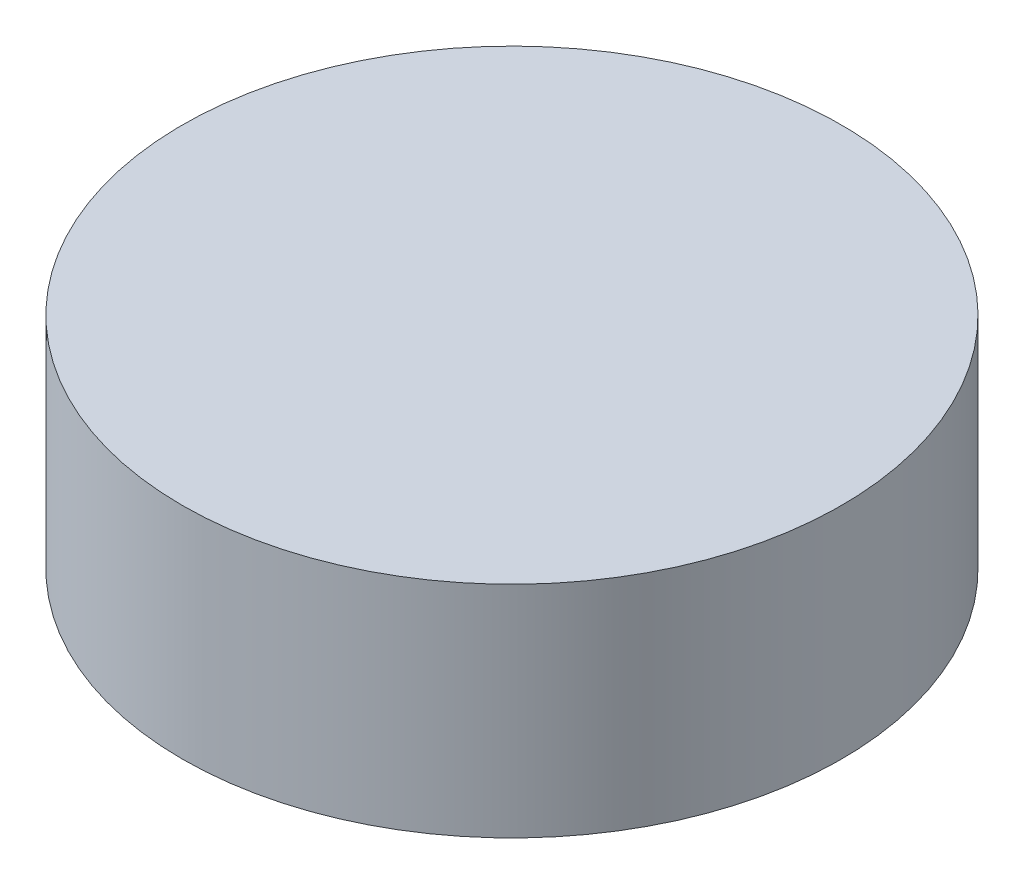
ISO-10303-21;
HEADER;
FILE_DESCRIPTION(('STEP AP214'),'2;1');
FILE_NAME('part.step','',(''),(''),'','','');
FILE_SCHEMA(('AUTOMOTIVE_DESIGN { 1 0 10303 214 1 1 1 1 }'));
ENDSEC;
DATA;
#1=APPLICATION_CONTEXT('core data for automotive mechanical design processes');
#2=APPLICATION_PROTOCOL_DEFINITION('international standard','automotive_design',2000,#1);
#3=PRODUCT_CONTEXT('',#1,'mechanical');
#4=PRODUCT('Part','Part','',(#3));
#5=PRODUCT_RELATED_PRODUCT_CATEGORY('part','',(#4));
#6=PRODUCT_DEFINITION_FORMATION('','',#4);
#7=PRODUCT_DEFINITION_CONTEXT('part definition',#1,'design');
#8=PRODUCT_DEFINITION('design','',#6,#7);
#9=PRODUCT_DEFINITION_SHAPE('','',#8);
#10=(LENGTH_UNIT() NAMED_UNIT(*) SI_UNIT(.MILLI.,.METRE.));
#11=(NAMED_UNIT(*) PLANE_ANGLE_UNIT() SI_UNIT($,.RADIAN.));
#12=(NAMED_UNIT(*) SI_UNIT($,.STERADIAN.) SOLID_ANGLE_UNIT());
#13=UNCERTAINTY_MEASURE_WITH_UNIT(LENGTH_MEASURE(1.E-05),#10,'distance_accuracy_value','');
#14=(GEOMETRIC_REPRESENTATION_CONTEXT(3) GLOBAL_UNCERTAINTY_ASSIGNED_CONTEXT((#13)) GLOBAL_UNIT_ASSIGNED_CONTEXT((#10,
#11,#12)) REPRESENTATION_CONTEXT('',''));
#15=CARTESIAN_POINT('',(0.,0.,0.));
#16=DIRECTION('',(0.,0.,1.));
#17=DIRECTION('',(1.,0.,0.));
#18=AXIS2_PLACEMENT_3D('',#15,#16,#17);
#19=CARTESIAN_POINT('',(0.,5.,0.));
#20=DIRECTION('',(0.,-1.,0.));
#21=DIRECTION('',(0.,0.,-1.));
#22=AXIS2_PLACEMENT_3D('',#19,#20,#21);
#23=CYLINDRICAL_SURFACE('',#22,7.5);
#24=CARTESIAN_POINT('',(0.,5.,0.));
#25=DIRECTION('',(0.,1.,0.));
#26=DIRECTION('',(0.,0.,1.));
#27=AXIS2_PLACEMENT_3D('',#24,#25,#26);
#28=CIRCLE('',#27,7.5);
#29=CARTESIAN_POINT('',(0.,5.,7.5));
#30=VERTEX_POINT('',#29);
#31=EDGE_CURVE('E12',#30,#30,#28,.T.);
#32=ORIENTED_EDGE('',*,*,#31,.F.);
#33=EDGE_LOOP('',(#32));
#34=FACE_BOUND('',#33,.T.);
#35=CARTESIAN_POINT('',(0.,0.,0.));
#36=DIRECTION('',(0.,1.,0.));
#37=DIRECTION('',(0.,0.,1.));
#38=AXIS2_PLACEMENT_3D('',#35,#36,#37);
#39=CIRCLE('',#38,7.5);
#40=CARTESIAN_POINT('',(0.,0.,7.5));
#41=VERTEX_POINT('',#40);
#42=EDGE_CURVE('E45',#41,#41,#39,.T.);
#43=ORIENTED_EDGE('',*,*,#42,.T.);
#44=EDGE_LOOP('',(#43));
#45=FACE_BOUND('',#44,.T.);
#46=ADVANCED_FACE('F42',(#34,#45),#23,.T.);
#47=CARTESIAN_POINT('',(0.,5.,0.));
#48=DIRECTION('',(0.,1.,0.));
#49=DIRECTION('',(0.,0.,1.));
#50=AXIS2_PLACEMENT_3D('',#47,#48,#49);
#51=PLANE('',#50);
#52=ORIENTED_EDGE('',*,*,#31,.T.);
#53=EDGE_LOOP('',(#52));
#54=FACE_BOUND('',#53,.T.);
#55=ADVANCED_FACE('F57',(#54),#51,.T.);
#56=CARTESIAN_POINT('',(0.,0.,0.));
#57=DIRECTION('',(0.,1.,0.));
#58=DIRECTION('',(0.,0.,1.));
#59=AXIS2_PLACEMENT_3D('',#56,#57,#58);
#60=PLANE('',#59);
#61=ORIENTED_EDGE('',*,*,#42,.F.);
#62=EDGE_LOOP('',(#61));
#63=FACE_BOUND('',#62,.T.);
#64=ADVANCED_FACE('F55',(#63),#60,.F.);
#65=CLOSED_SHELL('',(#46,#55,#64));
#66=MANIFOLD_SOLID_BREP('B2',#65);
#67=ADVANCED_BREP_SHAPE_REPRESENTATION('',(#18,#66),#14);
#68=SHAPE_DEFINITION_REPRESENTATION(#9,#67);
ENDSEC;
END-ISO-10303-21;
